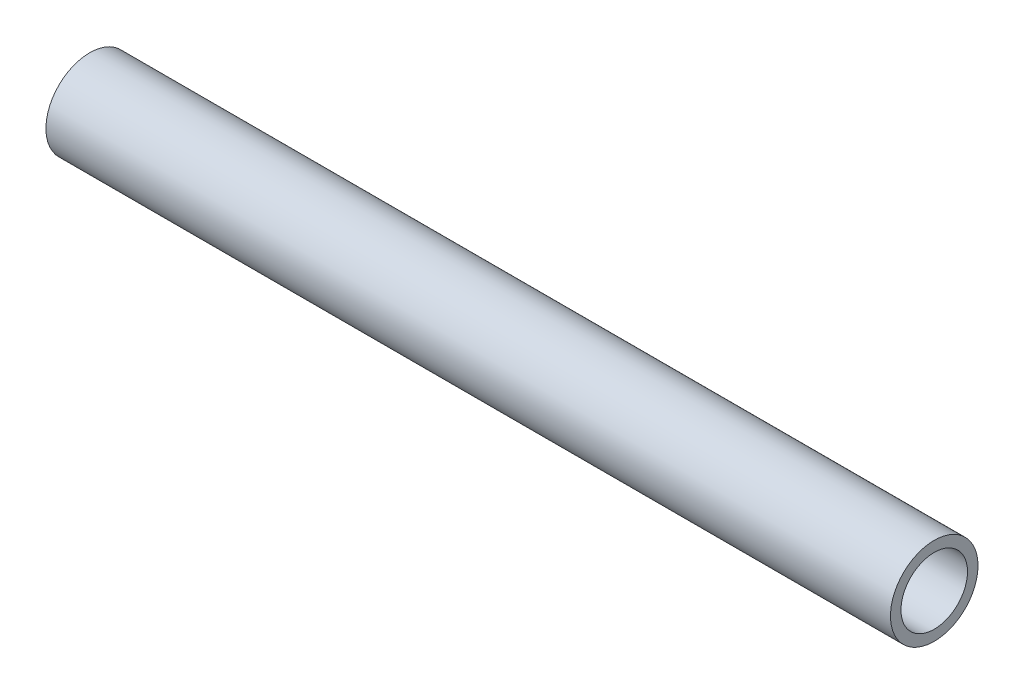
ISO-10303-21;
HEADER;
FILE_DESCRIPTION(('STEP AP214'),'2;1');
FILE_NAME('part.step','',(''),(''),'','','');
FILE_SCHEMA(('AUTOMOTIVE_DESIGN { 1 0 10303 214 1 1 1 1 }'));
ENDSEC;
DATA;
#1=APPLICATION_CONTEXT('core data for automotive mechanical design processes');
#2=APPLICATION_PROTOCOL_DEFINITION('international standard','automotive_design',2000,#1);
#3=PRODUCT_CONTEXT('',#1,'mechanical');
#4=PRODUCT('Part','Part','',(#3));
#5=PRODUCT_RELATED_PRODUCT_CATEGORY('part','',(#4));
#6=PRODUCT_DEFINITION_FORMATION('','',#4);
#7=PRODUCT_DEFINITION_CONTEXT('part definition',#1,'design');
#8=PRODUCT_DEFINITION('design','',#6,#7);
#9=PRODUCT_DEFINITION_SHAPE('','',#8);
#10=(LENGTH_UNIT() NAMED_UNIT(*) SI_UNIT(.MILLI.,.METRE.));
#11=(NAMED_UNIT(*) PLANE_ANGLE_UNIT() SI_UNIT($,.RADIAN.));
#12=(NAMED_UNIT(*) SI_UNIT($,.STERADIAN.) SOLID_ANGLE_UNIT());
#13=UNCERTAINTY_MEASURE_WITH_UNIT(LENGTH_MEASURE(1.E-05),#10,'distance_accuracy_value','');
#14=(GEOMETRIC_REPRESENTATION_CONTEXT(3) GLOBAL_UNCERTAINTY_ASSIGNED_CONTEXT((#13)) GLOBAL_UNIT_ASSIGNED_CONTEXT((#10,
#11,#12)) REPRESENTATION_CONTEXT('',''));
#15=CARTESIAN_POINT('',(0.,0.,0.));
#16=DIRECTION('',(0.,0.,1.));
#17=DIRECTION('',(1.,0.,0.));
#18=AXIS2_PLACEMENT_3D('',#15,#16,#17);
#19=CARTESIAN_POINT('',(245.,0.,0.));
#20=DIRECTION('',(1.,0.,0.));
#21=DIRECTION('',(0.,0.,-1.));
#22=AXIS2_PLACEMENT_3D('',#19,#20,#21);
#23=PLANE('',#22);
#24=CARTESIAN_POINT('',(245.,0.,0.));
#25=DIRECTION('',(1.,0.,0.));
#26=DIRECTION('',(0.,0.,-1.));
#27=AXIS2_PLACEMENT_3D('',#24,#25,#26);
#28=CIRCLE('',#27,12.7);
#29=CARTESIAN_POINT('',(245.,0.,-12.7));
#30=VERTEX_POINT('',#29);
#31=EDGE_CURVE('E10',#30,#30,#28,.T.);
#32=ORIENTED_EDGE('',*,*,#31,.T.);
#33=EDGE_LOOP('',(#32));
#34=FACE_BOUND('',#33,.T.);
#35=CARTESIAN_POINT('',(245.,0.,0.));
#36=DIRECTION('',(1.,0.,0.));
#37=DIRECTION('',(0.,0.,-1.));
#38=AXIS2_PLACEMENT_3D('',#35,#36,#37);
#39=CIRCLE('',#38,9.652);
#40=CARTESIAN_POINT('',(245.,0.,-9.652));
#41=VERTEX_POINT('',#40);
#42=EDGE_CURVE('E45',#41,#41,#39,.T.);
#43=ORIENTED_EDGE('',*,*,#42,.F.);
#44=EDGE_LOOP('',(#43));
#45=FACE_BOUND('',#44,.T.);
#46=ADVANCED_FACE('F34',(#34,#45),#23,.T.);
#47=CARTESIAN_POINT('',(0.,0.,0.));
#48=DIRECTION('',(1.,0.,0.));
#49=DIRECTION('',(0.,0.,-1.));
#50=AXIS2_PLACEMENT_3D('',#47,#48,#49);
#51=PLANE('',#50);
#52=CARTESIAN_POINT('',(0.,0.,0.));
#53=DIRECTION('',(1.,0.,0.));
#54=DIRECTION('',(0.,0.,-1.));
#55=AXIS2_PLACEMENT_3D('',#52,#53,#54);
#56=CIRCLE('',#55,12.7);
#57=CARTESIAN_POINT('',(0.,0.,-12.7));
#58=VERTEX_POINT('',#57);
#59=EDGE_CURVE('E38',#58,#58,#56,.T.);
#60=ORIENTED_EDGE('',*,*,#59,.F.);
#61=EDGE_LOOP('',(#60));
#62=FACE_BOUND('',#61,.T.);
#63=CARTESIAN_POINT('',(0.,0.,0.));
#64=DIRECTION('',(1.,0.,0.));
#65=DIRECTION('',(0.,0.,-1.));
#66=AXIS2_PLACEMENT_3D('',#63,#64,#65);
#67=CIRCLE('',#66,9.652);
#68=CARTESIAN_POINT('',(0.,0.,-9.652));
#69=VERTEX_POINT('',#68);
#70=EDGE_CURVE('E47',#69,#69,#67,.T.);
#71=ORIENTED_EDGE('',*,*,#70,.T.);
#72=EDGE_LOOP('',(#71));
#73=FACE_BOUND('',#72,.T.);
#74=ADVANCED_FACE('F57',(#62,#73),#51,.F.);
#75=CARTESIAN_POINT('',(245.,0.,0.));
#76=DIRECTION('',(-1.,0.,0.));
#77=DIRECTION('',(0.,0.,1.));
#78=AXIS2_PLACEMENT_3D('',#75,#76,#77);
#79=CYLINDRICAL_SURFACE('',#78,12.7);
#80=ORIENTED_EDGE('',*,*,#31,.F.);
#81=EDGE_LOOP('',(#80));
#82=FACE_BOUND('',#81,.T.);
#83=ORIENTED_EDGE('',*,*,#59,.T.);
#84=EDGE_LOOP('',(#83));
#85=FACE_BOUND('',#84,.T.);
#86=ADVANCED_FACE('F36',(#82,#85),#79,.T.);
#87=CARTESIAN_POINT('',(245.,0.,0.));
#88=DIRECTION('',(-1.,0.,0.));
#89=DIRECTION('',(0.,0.,1.));
#90=AXIS2_PLACEMENT_3D('',#87,#88,#89);
#91=CYLINDRICAL_SURFACE('',#90,9.652);
#92=ORIENTED_EDGE('',*,*,#42,.T.);
#93=EDGE_LOOP('',(#92));
#94=FACE_BOUND('',#93,.T.);
#95=ORIENTED_EDGE('',*,*,#70,.F.);
#96=EDGE_LOOP('',(#95));
#97=FACE_BOUND('',#96,.T.);
#98=ADVANCED_FACE('F53',(#94,#97),#91,.F.);
#99=CLOSED_SHELL('',(#46,#74,#86,#98));
#100=MANIFOLD_SOLID_BREP('B2',#99);
#101=ADVANCED_BREP_SHAPE_REPRESENTATION('',(#18,#100),#14);
#102=SHAPE_DEFINITION_REPRESENTATION(#9,#101);
ENDSEC;
END-ISO-10303-21;
